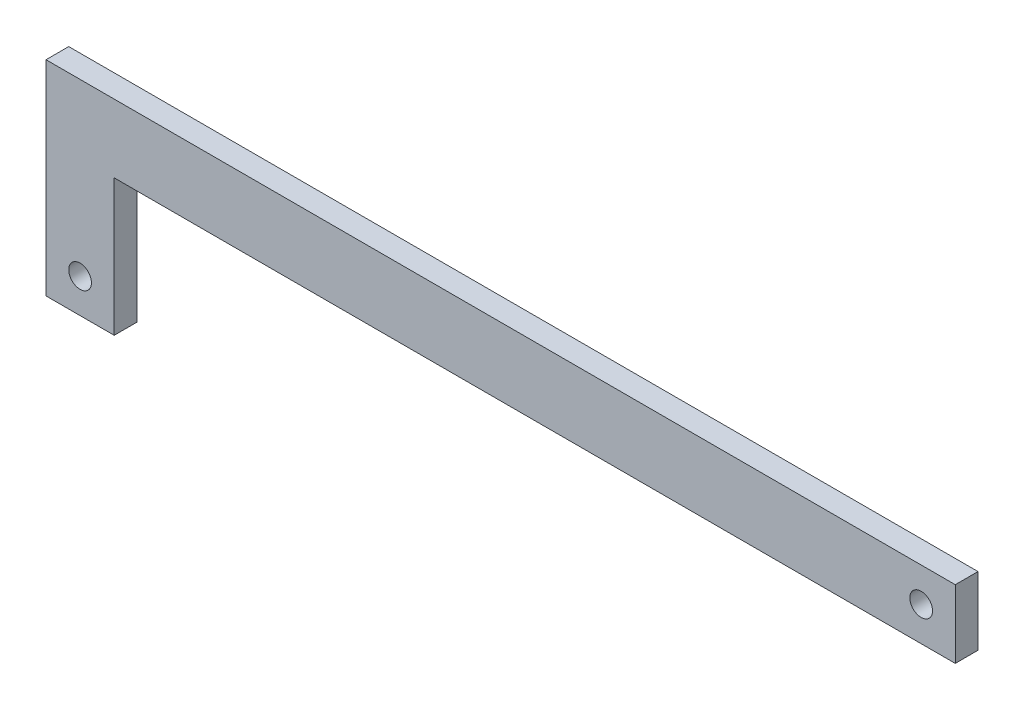
ISO-10303-21;
HEADER;
FILE_DESCRIPTION(('STEP AP214'),'2;1');
FILE_NAME('part.step','',(''),(''),'','','');
FILE_SCHEMA(('AUTOMOTIVE_DESIGN { 1 0 10303 214 1 1 1 1 }'));
ENDSEC;
DATA;
#1=APPLICATION_CONTEXT('core data for automotive mechanical design processes');
#2=APPLICATION_PROTOCOL_DEFINITION('international standard','automotive_design',2000,#1);
#3=PRODUCT_CONTEXT('',#1,'mechanical');
#4=PRODUCT('Part','Part','',(#3));
#5=PRODUCT_RELATED_PRODUCT_CATEGORY('part','',(#4));
#6=PRODUCT_DEFINITION_FORMATION('','',#4);
#7=PRODUCT_DEFINITION_CONTEXT('part definition',#1,'design');
#8=PRODUCT_DEFINITION('design','',#6,#7);
#9=PRODUCT_DEFINITION_SHAPE('','',#8);
#10=(LENGTH_UNIT() NAMED_UNIT(*) SI_UNIT(.MILLI.,.METRE.));
#11=(NAMED_UNIT(*) PLANE_ANGLE_UNIT() SI_UNIT($,.RADIAN.));
#12=(NAMED_UNIT(*) SI_UNIT($,.STERADIAN.) SOLID_ANGLE_UNIT());
#13=UNCERTAINTY_MEASURE_WITH_UNIT(LENGTH_MEASURE(1.E-05),#10,'distance_accuracy_value','');
#14=(GEOMETRIC_REPRESENTATION_CONTEXT(3) GLOBAL_UNCERTAINTY_ASSIGNED_CONTEXT((#13)) GLOBAL_UNIT_ASSIGNED_CONTEXT((#10,
#11,#12)) REPRESENTATION_CONTEXT('',''));
#15=CARTESIAN_POINT('',(0.,0.,0.));
#16=DIRECTION('',(0.,0.,1.));
#17=DIRECTION('',(1.,0.,0.));
#18=AXIS2_PLACEMENT_3D('',#15,#16,#17);
#19=CARTESIAN_POINT('',(0.,0.,6.35));
#20=DIRECTION('',(0.,1.,0.));
#21=DIRECTION('',(0.,0.,1.));
#22=AXIS2_PLACEMENT_3D('',#19,#20,#21);
#23=PLANE('',#22);
#24=DIRECTION('',(1.,0.,0.));
#25=VECTOR('',#24,1.);
#26=CARTESIAN_POINT('',(0.,0.,0.));
#27=LINE('',#26,#25);
#28=CARTESIAN_POINT('',(19.05,0.,0.));
#29=VERTEX_POINT('',#28);
#30=CARTESIAN_POINT('',(254.,0.,0.));
#31=VERTEX_POINT('',#30);
#32=EDGE_CURVE('E128',#29,#31,#27,.T.);
#33=ORIENTED_EDGE('',*,*,#32,.T.);
#34=DIRECTION('',(0.,0.,-1.));
#35=VECTOR('',#34,1.);
#36=CARTESIAN_POINT('',(254.,0.,6.35));
#37=LINE('',#36,#35);
#38=CARTESIAN_POINT('',(254.,0.,6.35));
#39=VERTEX_POINT('',#38);
#40=EDGE_CURVE('E11',#39,#31,#37,.T.);
#41=ORIENTED_EDGE('',*,*,#40,.F.);
#42=DIRECTION('',(1.,0.,0.));
#43=VECTOR('',#42,1.);
#44=CARTESIAN_POINT('',(0.,0.,6.35));
#45=LINE('',#44,#43);
#46=CARTESIAN_POINT('',(19.05,0.,6.35));
#47=VERTEX_POINT('',#46);
#48=EDGE_CURVE('E234',#47,#39,#45,.T.);
#49=ORIENTED_EDGE('',*,*,#48,.F.);
#50=DIRECTION('',(0.,0.,-1.));
#51=VECTOR('',#50,1.);
#52=CARTESIAN_POINT('',(19.05,0.,6.35));
#53=LINE('',#52,#51);
#54=EDGE_CURVE('E52',#47,#29,#53,.T.);
#55=ORIENTED_EDGE('',*,*,#54,.T.);
#56=EDGE_LOOP('',(#33,#41,#49,#55));
#57=FACE_BOUND('',#56,.T.);
#58=ADVANCED_FACE('F35',(#57),#23,.F.);
#59=CARTESIAN_POINT('',(254.,0.,6.35));
#60=DIRECTION('',(-1.,0.,0.));
#61=DIRECTION('',(0.,0.,1.));
#62=AXIS2_PLACEMENT_3D('',#59,#60,#61);
#63=PLANE('',#62);
#64=DIRECTION('',(0.,1.,0.));
#65=VECTOR('',#64,1.);
#66=CARTESIAN_POINT('',(254.,0.,0.));
#67=LINE('',#66,#65);
#68=CARTESIAN_POINT('',(254.,19.05,0.));
#69=VERTEX_POINT('',#68);
#70=EDGE_CURVE('E130',#31,#69,#67,.T.);
#71=ORIENTED_EDGE('',*,*,#70,.T.);
#72=DIRECTION('',(0.,0.,-1.));
#73=VECTOR('',#72,1.);
#74=CARTESIAN_POINT('',(254.,19.05,6.35));
#75=LINE('',#74,#73);
#76=CARTESIAN_POINT('',(254.,19.05,6.35));
#77=VERTEX_POINT('',#76);
#78=EDGE_CURVE('E44',#77,#69,#75,.T.);
#79=ORIENTED_EDGE('',*,*,#78,.F.);
#80=DIRECTION('',(0.,1.,0.));
#81=VECTOR('',#80,1.);
#82=CARTESIAN_POINT('',(254.,0.,6.35));
#83=LINE('',#82,#81);
#84=EDGE_CURVE('E85',#39,#77,#83,.T.);
#85=ORIENTED_EDGE('',*,*,#84,.F.);
#86=ORIENTED_EDGE('',*,*,#40,.T.);
#87=EDGE_LOOP('',(#71,#79,#85,#86));
#88=FACE_BOUND('',#87,.T.);
#89=ADVANCED_FACE('F151',(#88),#63,.F.);
#90=CARTESIAN_POINT('',(0.,19.05,6.35));
#91=DIRECTION('',(0.,1.,0.));
#92=DIRECTION('',(0.,0.,1.));
#93=AXIS2_PLACEMENT_3D('',#90,#91,#92);
#94=PLANE('',#93);
#95=DIRECTION('',(1.,0.,0.));
#96=VECTOR('',#95,1.);
#97=CARTESIAN_POINT('',(0.,19.05,0.));
#98=LINE('',#97,#96);
#99=CARTESIAN_POINT('',(0.,19.05,0.));
#100=VERTEX_POINT('',#99);
#101=EDGE_CURVE('E133',#100,#69,#98,.T.);
#102=ORIENTED_EDGE('',*,*,#101,.F.);
#103=DIRECTION('',(0.,0.,-1.));
#104=VECTOR('',#103,1.);
#105=CARTESIAN_POINT('',(0.,19.05,6.35));
#106=LINE('',#105,#104);
#107=CARTESIAN_POINT('',(0.,19.05,6.35));
#108=VERTEX_POINT('',#107);
#109=EDGE_CURVE('E104',#108,#100,#106,.T.);
#110=ORIENTED_EDGE('',*,*,#109,.F.);
#111=DIRECTION('',(1.,0.,0.));
#112=VECTOR('',#111,1.);
#113=CARTESIAN_POINT('',(0.,19.05,6.35));
#114=LINE('',#113,#112);
#115=EDGE_CURVE('E116',#108,#77,#114,.T.);
#116=ORIENTED_EDGE('',*,*,#115,.T.);
#117=ORIENTED_EDGE('',*,*,#78,.T.);
#118=EDGE_LOOP('',(#102,#110,#116,#117));
#119=FACE_BOUND('',#118,.T.);
#120=ADVANCED_FACE('F150',(#119),#94,.T.);
#121=CARTESIAN_POINT('',(0.,0.,6.35));
#122=DIRECTION('',(-1.,0.,0.));
#123=DIRECTION('',(0.,0.,1.));
#124=AXIS2_PLACEMENT_3D('',#121,#122,#123);
#125=PLANE('',#124);
#126=DIRECTION('',(0.,1.,0.));
#127=VECTOR('',#126,1.);
#128=CARTESIAN_POINT('',(0.,0.,0.));
#129=LINE('',#128,#127);
#130=CARTESIAN_POINT('',(0.,-38.1,0.));
#131=VERTEX_POINT('',#130);
#132=EDGE_CURVE('E101',#131,#100,#129,.T.);
#133=ORIENTED_EDGE('',*,*,#132,.F.);
#134=DIRECTION('',(0.,0.,-1.));
#135=VECTOR('',#134,1.);
#136=CARTESIAN_POINT('',(0.,-38.1,6.35));
#137=LINE('',#136,#135);
#138=CARTESIAN_POINT('',(0.,-38.1,6.35));
#139=VERTEX_POINT('',#138);
#140=EDGE_CURVE('E95',#139,#131,#137,.T.);
#141=ORIENTED_EDGE('',*,*,#140,.F.);
#142=DIRECTION('',(0.,1.,0.));
#143=VECTOR('',#142,1.);
#144=CARTESIAN_POINT('',(0.,0.,6.35));
#145=LINE('',#144,#143);
#146=EDGE_CURVE('E99',#139,#108,#145,.T.);
#147=ORIENTED_EDGE('',*,*,#146,.T.);
#148=ORIENTED_EDGE('',*,*,#109,.T.);
#149=EDGE_LOOP('',(#133,#141,#147,#148));
#150=FACE_BOUND('',#149,.T.);
#151=ADVANCED_FACE('F97',(#150),#125,.T.);
#152=CARTESIAN_POINT('',(0.,-38.1,6.35));
#153=DIRECTION('',(0.,1.,0.));
#154=DIRECTION('',(0.,0.,1.));
#155=AXIS2_PLACEMENT_3D('',#152,#153,#154);
#156=PLANE('',#155);
#157=DIRECTION('',(1.,0.,0.));
#158=VECTOR('',#157,1.);
#159=CARTESIAN_POINT('',(0.,-38.1,0.));
#160=LINE('',#159,#158);
#161=CARTESIAN_POINT('',(19.05,-38.1,0.));
#162=VERTEX_POINT('',#161);
#163=EDGE_CURVE('E137',#131,#162,#160,.T.);
#164=ORIENTED_EDGE('',*,*,#163,.T.);
#165=DIRECTION('',(0.,0.,-1.));
#166=VECTOR('',#165,1.);
#167=CARTESIAN_POINT('',(19.05,-38.1,6.35));
#168=LINE('',#167,#166);
#169=CARTESIAN_POINT('',(19.05,-38.1,6.35));
#170=VERTEX_POINT('',#169);
#171=EDGE_CURVE('E73',#170,#162,#168,.T.);
#172=ORIENTED_EDGE('',*,*,#171,.F.);
#173=DIRECTION('',(1.,0.,0.));
#174=VECTOR('',#173,1.);
#175=CARTESIAN_POINT('',(0.,-38.1,6.35));
#176=LINE('',#175,#174);
#177=EDGE_CURVE('E106',#139,#170,#176,.T.);
#178=ORIENTED_EDGE('',*,*,#177,.F.);
#179=ORIENTED_EDGE('',*,*,#140,.T.);
#180=EDGE_LOOP('',(#164,#172,#178,#179));
#181=FACE_BOUND('',#180,.T.);
#182=ADVANCED_FACE('F107',(#181),#156,.F.);
#183=CARTESIAN_POINT('',(19.05,0.,6.35));
#184=DIRECTION('',(1.,0.,0.));
#185=DIRECTION('',(0.,1.,0.));
#186=AXIS2_PLACEMENT_3D('',#183,#184,#185);
#187=PLANE('',#186);
#188=DIRECTION('',(0.,-1.,0.));
#189=VECTOR('',#188,1.);
#190=CARTESIAN_POINT('',(19.05,0.,0.));
#191=LINE('',#190,#189);
#192=EDGE_CURVE('E139',#29,#162,#191,.T.);
#193=ORIENTED_EDGE('',*,*,#192,.F.);
#194=ORIENTED_EDGE('',*,*,#54,.F.);
#195=DIRECTION('',(0.,-1.,0.));
#196=VECTOR('',#195,1.);
#197=CARTESIAN_POINT('',(19.05,0.,6.35));
#198=LINE('',#197,#196);
#199=EDGE_CURVE('E110',#47,#170,#198,.T.);
#200=ORIENTED_EDGE('',*,*,#199,.T.);
#201=ORIENTED_EDGE('',*,*,#171,.T.);
#202=EDGE_LOOP('',(#193,#194,#200,#201));
#203=FACE_BOUND('',#202,.T.);
#204=ADVANCED_FACE('F156',(#203),#187,.T.);
#205=CARTESIAN_POINT('',(244.475,9.52500000000003,6.35));
#206=DIRECTION('',(0.,0.,-1.));
#207=DIRECTION('',(-1.,0.,0.));
#208=AXIS2_PLACEMENT_3D('',#205,#206,#207);
#209=CYLINDRICAL_SURFACE('',#208,3.175);
#210=CARTESIAN_POINT('',(244.475,9.52500000000003,6.35));
#211=DIRECTION('',(0.,0.,1.));
#212=DIRECTION('',(1.,0.,0.));
#213=AXIS2_PLACEMENT_3D('',#210,#211,#212);
#214=CIRCLE('',#213,3.175);
#215=CARTESIAN_POINT('',(247.65,9.52500000000003,6.35));
#216=VERTEX_POINT('',#215);
#217=EDGE_CURVE('E145',#216,#216,#214,.T.);
#218=ORIENTED_EDGE('',*,*,#217,.T.);
#219=EDGE_LOOP('',(#218));
#220=FACE_BOUND('',#219,.T.);
#221=CARTESIAN_POINT('',(244.475,9.52500000000003,0.));
#222=DIRECTION('',(0.,0.,1.));
#223=DIRECTION('',(1.,0.,0.));
#224=AXIS2_PLACEMENT_3D('',#221,#222,#223);
#225=CIRCLE('',#224,3.175);
#226=CARTESIAN_POINT('',(247.65,9.52500000000003,0.));
#227=VERTEX_POINT('',#226);
#228=EDGE_CURVE('E125',#227,#227,#225,.T.);
#229=ORIENTED_EDGE('',*,*,#228,.F.);
#230=EDGE_LOOP('',(#229));
#231=FACE_BOUND('',#230,.T.);
#232=ADVANCED_FACE('F37',(#220,#231),#209,.F.);
#233=CARTESIAN_POINT('',(9.525,-28.575,6.35));
#234=DIRECTION('',(0.,0.,-1.));
#235=DIRECTION('',(-1.,0.,0.));
#236=AXIS2_PLACEMENT_3D('',#233,#234,#235);
#237=CYLINDRICAL_SURFACE('',#236,3.175);
#238=CARTESIAN_POINT('',(9.525,-28.575,6.35));
#239=DIRECTION('',(0.,0.,1.));
#240=DIRECTION('',(1.,0.,0.));
#241=AXIS2_PLACEMENT_3D('',#238,#239,#240);
#242=CIRCLE('',#241,3.175);
#243=CARTESIAN_POINT('',(12.7,-28.575,6.35));
#244=VERTEX_POINT('',#243);
#245=EDGE_CURVE('E122',#244,#244,#242,.T.);
#246=ORIENTED_EDGE('',*,*,#245,.T.);
#247=EDGE_LOOP('',(#246));
#248=FACE_BOUND('',#247,.T.);
#249=CARTESIAN_POINT('',(9.525,-28.575,0.));
#250=DIRECTION('',(0.,0.,1.));
#251=DIRECTION('',(1.,0.,0.));
#252=AXIS2_PLACEMENT_3D('',#249,#250,#251);
#253=CIRCLE('',#252,3.175);
#254=CARTESIAN_POINT('',(12.7,-28.575,0.));
#255=VERTEX_POINT('',#254);
#256=EDGE_CURVE('E142',#255,#255,#253,.T.);
#257=ORIENTED_EDGE('',*,*,#256,.F.);
#258=EDGE_LOOP('',(#257));
#259=FACE_BOUND('',#258,.T.);
#260=ADVANCED_FACE('F163',(#248,#259),#237,.F.);
#261=CARTESIAN_POINT('',(0.,0.,6.35));
#262=DIRECTION('',(0.,0.,1.));
#263=DIRECTION('',(1.,0.,0.));
#264=AXIS2_PLACEMENT_3D('',#261,#262,#263);
#265=PLANE('',#264);
#266=ORIENTED_EDGE('',*,*,#217,.F.);
#267=EDGE_LOOP('',(#266));
#268=FACE_BOUND('',#267,.T.);
#269=ORIENTED_EDGE('',*,*,#48,.T.);
#270=ORIENTED_EDGE('',*,*,#84,.T.);
#271=ORIENTED_EDGE('',*,*,#115,.F.);
#272=ORIENTED_EDGE('',*,*,#146,.F.);
#273=ORIENTED_EDGE('',*,*,#177,.T.);
#274=ORIENTED_EDGE('',*,*,#199,.F.);
#275=EDGE_LOOP('',(#269,#270,#271,#272,#273,#274));
#276=FACE_BOUND('',#275,.T.);
#277=ORIENTED_EDGE('',*,*,#245,.F.);
#278=EDGE_LOOP('',(#277));
#279=FACE_BOUND('',#278,.T.);
#280=ADVANCED_FACE('F113',(#268,#276,#279),#265,.T.);
#281=CARTESIAN_POINT('',(0.,0.,0.));
#282=DIRECTION('',(0.,0.,1.));
#283=DIRECTION('',(1.,0.,0.));
#284=AXIS2_PLACEMENT_3D('',#281,#282,#283);
#285=PLANE('',#284);
#286=ORIENTED_EDGE('',*,*,#228,.T.);
#287=EDGE_LOOP('',(#286));
#288=FACE_BOUND('',#287,.T.);
#289=ORIENTED_EDGE('',*,*,#32,.F.);
#290=ORIENTED_EDGE('',*,*,#192,.T.);
#291=ORIENTED_EDGE('',*,*,#163,.F.);
#292=ORIENTED_EDGE('',*,*,#132,.T.);
#293=ORIENTED_EDGE('',*,*,#101,.T.);
#294=ORIENTED_EDGE('',*,*,#70,.F.);
#295=EDGE_LOOP('',(#289,#290,#291,#292,#293,#294));
#296=FACE_BOUND('',#295,.T.);
#297=ORIENTED_EDGE('',*,*,#256,.T.);
#298=EDGE_LOOP('',(#297));
#299=FACE_BOUND('',#298,.T.);
#300=ADVANCED_FACE('F154',(#288,#296,#299),#285,.F.);
#301=CLOSED_SHELL('',(#58,#89,#120,#151,#182,#204,#232,#260,#280,#300));
#302=MANIFOLD_SOLID_BREP('B2',#301);
#303=ADVANCED_BREP_SHAPE_REPRESENTATION('',(#18,#302),#14);
#304=SHAPE_DEFINITION_REPRESENTATION(#9,#303);
ENDSEC;
END-ISO-10303-21;
